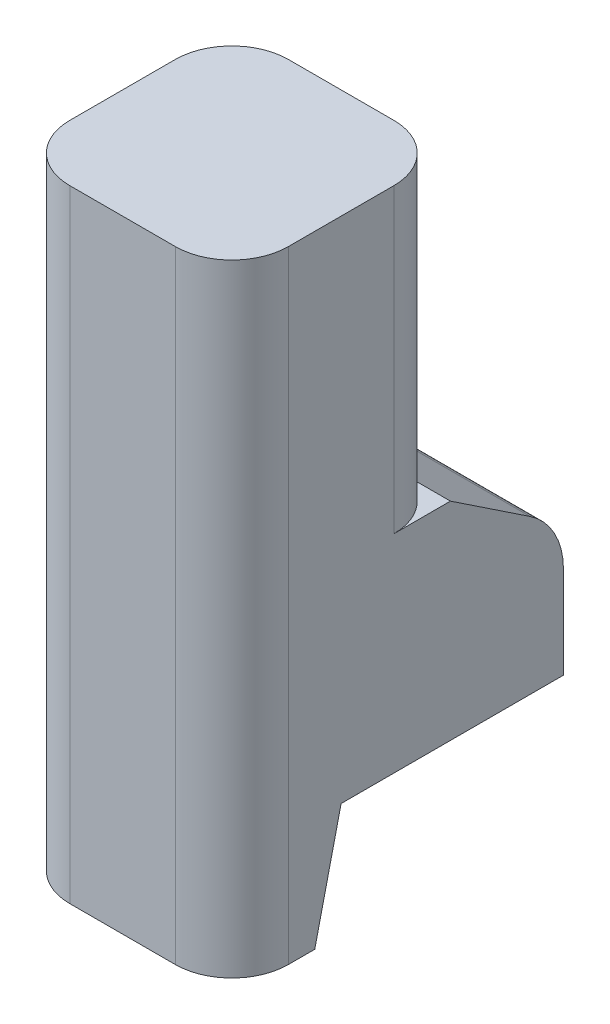
ISO-10303-21;
HEADER;
FILE_DESCRIPTION(('STEP AP214'),'2;1');
FILE_NAME('part.step','',(''),(''),'','','');
FILE_SCHEMA(('AUTOMOTIVE_DESIGN { 1 0 10303 214 1 1 1 1 }'));
ENDSEC;
DATA;
#1=APPLICATION_CONTEXT('core data for automotive mechanical design processes');
#2=APPLICATION_PROTOCOL_DEFINITION('international standard','automotive_design',2000,#1);
#3=PRODUCT_CONTEXT('',#1,'mechanical');
#4=PRODUCT('Part','Part','',(#3));
#5=PRODUCT_RELATED_PRODUCT_CATEGORY('part','',(#4));
#6=PRODUCT_DEFINITION_FORMATION('','',#4);
#7=PRODUCT_DEFINITION_CONTEXT('part definition',#1,'design');
#8=PRODUCT_DEFINITION('design','',#6,#7);
#9=PRODUCT_DEFINITION_SHAPE('','',#8);
#10=(LENGTH_UNIT() NAMED_UNIT(*) SI_UNIT(.MILLI.,.METRE.));
#11=(NAMED_UNIT(*) PLANE_ANGLE_UNIT() SI_UNIT($,.RADIAN.));
#12=(NAMED_UNIT(*) SI_UNIT($,.STERADIAN.) SOLID_ANGLE_UNIT());
#13=UNCERTAINTY_MEASURE_WITH_UNIT(LENGTH_MEASURE(1.E-05),#10,'distance_accuracy_value','');
#14=(GEOMETRIC_REPRESENTATION_CONTEXT(3) GLOBAL_UNCERTAINTY_ASSIGNED_CONTEXT((#13)) GLOBAL_UNIT_ASSIGNED_CONTEXT((#10,
#11,#12)) REPRESENTATION_CONTEXT('',''));
#15=CARTESIAN_POINT('',(0.,0.,0.));
#16=DIRECTION('',(0.,0.,1.));
#17=DIRECTION('',(1.,0.,0.));
#18=AXIS2_PLACEMENT_3D('',#15,#16,#17);
#19=CARTESIAN_POINT('',(5.8,16.5,-5.8));
#20=DIRECTION('',(-1.,0.,0.));
#21=DIRECTION('',(0.,0.,1.));
#22=AXIS2_PLACEMENT_3D('',#19,#20,#21);
#23=PLANE('',#22);
#24=DIRECTION('',(0.,-0.973841209741793,0.227229615606418));
#25=VECTOR('',#24,1.);
#26=CARTESIAN_POINT('',(5.8,17.1085353003161,-3.19199157007376));
#27=LINE('',#26,#25);
#28=CARTESIAN_POINT('',(5.8,3.,0.0999999999999998));
#29=VERTEX_POINT('',#28);
#30=CARTESIAN_POINT('',(5.8,0.,0.8));
#31=VERTEX_POINT('',#30);
#32=EDGE_CURVE('E134',#29,#31,#27,.T.);
#33=ORIENTED_EDGE('',*,*,#32,.F.);
#34=DIRECTION('',(0.,0.,1.));
#35=VECTOR('',#34,1.);
#36=CARTESIAN_POINT('',(5.8,3.,-5.8));
#37=LINE('',#36,#35);
#38=CARTESIAN_POINT('',(5.8,3.,-5.8));
#39=VERTEX_POINT('',#38);
#40=EDGE_CURVE('E143',#39,#29,#37,.T.);
#41=ORIENTED_EDGE('',*,*,#40,.F.);
#42=DIRECTION('',(0.,-1.,0.));
#43=VECTOR('',#42,1.);
#44=CARTESIAN_POINT('',(5.8,16.5,-5.8));
#45=LINE('',#44,#43);
#46=CARTESIAN_POINT('',(5.8,5.42963248302401,-5.8));
#47=VERTEX_POINT('',#46);
#48=EDGE_CURVE('E178',#47,#39,#45,.T.);
#49=ORIENTED_EDGE('',*,*,#48,.F.);
#50=CARTESIAN_POINT('',(5.8,5.42963248302401,-3.8));
#51=DIRECTION('',(-1.,0.,0.));
#52=DIRECTION('',(0.,0.,1.));
#53=AXIS2_PLACEMENT_3D('',#50,#51,#52);
#54=CIRCLE('',#53,2.);
#55=CARTESIAN_POINT('',(5.8,7.09373307169969,-4.90940039245046));
#56=VERTEX_POINT('',#55);
#57=EDGE_CURVE('E11',#47,#56,#54,.F.);
#58=ORIENTED_EDGE('',*,*,#57,.T.);
#59=DIRECTION('',(0.,-0.554700196225229,-0.832050294337844));
#60=VECTOR('',#59,1.);
#61=CARTESIAN_POINT('',(5.8,9.57692307692308,-1.18461538461538));
#62=LINE('',#61,#60);
#63=CARTESIAN_POINT('',(5.8,8.5,-2.8));
#64=VERTEX_POINT('',#63);
#65=EDGE_CURVE('E230',#64,#56,#62,.T.);
#66=ORIENTED_EDGE('',*,*,#65,.F.);
#67=DIRECTION('',(0.,0.,-1.));
#68=VECTOR('',#67,1.);
#69=CARTESIAN_POINT('',(5.8,8.5,-5.8));
#70=LINE('',#69,#68);
#71=CARTESIAN_POINT('',(5.8,8.5,-1.3));
#72=VERTEX_POINT('',#71);
#73=EDGE_CURVE('E246',#72,#64,#70,.T.);
#74=ORIENTED_EDGE('',*,*,#73,.F.);
#75=DIRECTION('',(0.,1.,0.));
#76=VECTOR('',#75,1.);
#77=CARTESIAN_POINT('',(5.8,16.5,-1.3));
#78=LINE('',#77,#76);
#79=CARTESIAN_POINT('',(5.8,16.5,-1.3));
#80=VERTEX_POINT('',#79);
#81=EDGE_CURVE('E203',#72,#80,#78,.T.);
#82=ORIENTED_EDGE('',*,*,#81,.T.);
#83=DIRECTION('',(0.,0.,-1.));
#84=VECTOR('',#83,1.);
#85=CARTESIAN_POINT('',(5.8,16.5,-5.8));
#86=LINE('',#85,#84);
#87=CARTESIAN_POINT('',(5.8,16.5,1.5));
#88=VERTEX_POINT('',#87);
#89=EDGE_CURVE('E161',#88,#80,#86,.T.);
#90=ORIENTED_EDGE('',*,*,#89,.F.);
#91=DIRECTION('',(0.,-1.,0.));
#92=VECTOR('',#91,1.);
#93=CARTESIAN_POINT('',(5.8,16.5,1.5));
#94=LINE('',#93,#92);
#95=CARTESIAN_POINT('',(5.8,0.,1.5));
#96=VERTEX_POINT('',#95);
#97=EDGE_CURVE('E206',#88,#96,#94,.T.);
#98=ORIENTED_EDGE('',*,*,#97,.T.);
#99=DIRECTION('',(0.,0.,-1.));
#100=VECTOR('',#99,1.);
#101=CARTESIAN_POINT('',(5.8,0.,-5.8));
#102=LINE('',#101,#100);
#103=EDGE_CURVE('E142',#96,#31,#102,.T.);
#104=ORIENTED_EDGE('',*,*,#103,.T.);
#105=EDGE_LOOP('',(#33,#41,#49,#58,#66,#74,#82,#90,#98,#104));
#106=FACE_BOUND('',#105,.T.);
#107=ADVANCED_FACE('F33',(#106),#23,.F.);
#108=CARTESIAN_POINT('',(0.,16.5,-5.8));
#109=DIRECTION('',(1.,0.,0.));
#110=DIRECTION('',(0.,0.,-1.));
#111=AXIS2_PLACEMENT_3D('',#108,#109,#110);
#112=PLANE('',#111);
#113=DIRECTION('',(0.,0.973841209741793,-0.227229615606418));
#114=VECTOR('',#113,1.);
#115=CARTESIAN_POINT('',(0.,17.1085353003161,-3.19199157007376));
#116=LINE('',#115,#114);
#117=CARTESIAN_POINT('',(0.,0.,0.8));
#118=VERTEX_POINT('',#117);
#119=CARTESIAN_POINT('',(0.,3.,0.1));
#120=VERTEX_POINT('',#119);
#121=EDGE_CURVE('E137',#118,#120,#116,.T.);
#122=ORIENTED_EDGE('',*,*,#121,.F.);
#123=DIRECTION('',(0.,0.,1.));
#124=VECTOR('',#123,1.);
#125=CARTESIAN_POINT('',(0.,0.,-5.8));
#126=LINE('',#125,#124);
#127=CARTESIAN_POINT('',(0.,0.,1.5));
#128=VERTEX_POINT('',#127);
#129=EDGE_CURVE('E173',#118,#128,#126,.T.);
#130=ORIENTED_EDGE('',*,*,#129,.T.);
#131=DIRECTION('',(0.,-1.,0.));
#132=VECTOR('',#131,1.);
#133=CARTESIAN_POINT('',(0.,16.5,1.5));
#134=LINE('',#133,#132);
#135=CARTESIAN_POINT('',(0.,16.5,1.5));
#136=VERTEX_POINT('',#135);
#137=EDGE_CURVE('E193',#128,#136,#134,.F.);
#138=ORIENTED_EDGE('',*,*,#137,.T.);
#139=DIRECTION('',(0.,0.,1.));
#140=VECTOR('',#139,1.);
#141=CARTESIAN_POINT('',(0.,16.5,-5.8));
#142=LINE('',#141,#140);
#143=CARTESIAN_POINT('',(0.,16.5,-1.3));
#144=VERTEX_POINT('',#143);
#145=EDGE_CURVE('E164',#144,#136,#142,.T.);
#146=ORIENTED_EDGE('',*,*,#145,.F.);
#147=DIRECTION('',(0.,1.,0.));
#148=VECTOR('',#147,1.);
#149=CARTESIAN_POINT('',(0.,16.5,-1.3));
#150=LINE('',#149,#148);
#151=CARTESIAN_POINT('',(0.,8.5,-1.3));
#152=VERTEX_POINT('',#151);
#153=EDGE_CURVE('E190',#144,#152,#150,.F.);
#154=ORIENTED_EDGE('',*,*,#153,.T.);
#155=DIRECTION('',(0.,0.,1.));
#156=VECTOR('',#155,1.);
#157=CARTESIAN_POINT('',(0.,8.5,-5.8));
#158=LINE('',#157,#156);
#159=CARTESIAN_POINT('',(0.,8.5,-2.8));
#160=VERTEX_POINT('',#159);
#161=EDGE_CURVE('E235',#160,#152,#158,.T.);
#162=ORIENTED_EDGE('',*,*,#161,.F.);
#163=DIRECTION('',(0.,0.554700196225229,0.832050294337844));
#164=VECTOR('',#163,1.);
#165=CARTESIAN_POINT('',(0.,9.57692307692308,-1.18461538461538));
#166=LINE('',#165,#164);
#167=CARTESIAN_POINT('',(0.,7.09373307169969,-4.90940039245046));
#168=VERTEX_POINT('',#167);
#169=EDGE_CURVE('E227',#168,#160,#166,.T.);
#170=ORIENTED_EDGE('',*,*,#169,.F.);
#171=CARTESIAN_POINT('',(0.,5.42963248302401,-3.8));
#172=DIRECTION('',(1.,0.,0.));
#173=DIRECTION('',(0.,0.,-1.));
#174=AXIS2_PLACEMENT_3D('',#171,#172,#173);
#175=CIRCLE('',#174,2.);
#176=CARTESIAN_POINT('',(0.,5.42963248302401,-5.8));
#177=VERTEX_POINT('',#176);
#178=EDGE_CURVE('E55',#168,#177,#175,.F.);
#179=ORIENTED_EDGE('',*,*,#178,.T.);
#180=DIRECTION('',(0.,-1.,0.));
#181=VECTOR('',#180,1.);
#182=CARTESIAN_POINT('',(0.,16.5,-5.8));
#183=LINE('',#182,#181);
#184=CARTESIAN_POINT('',(0.,3.,-5.8));
#185=VERTEX_POINT('',#184);
#186=EDGE_CURVE('E171',#177,#185,#183,.T.);
#187=ORIENTED_EDGE('',*,*,#186,.T.);
#188=DIRECTION('',(0.,0.,-1.));
#189=VECTOR('',#188,1.);
#190=CARTESIAN_POINT('',(0.,3.,-5.8));
#191=LINE('',#190,#189);
#192=EDGE_CURVE('E157',#120,#185,#191,.T.);
#193=ORIENTED_EDGE('',*,*,#192,.F.);
#194=EDGE_LOOP('',(#122,#130,#138,#146,#154,#162,#170,#179,#187,#193));
#195=FACE_BOUND('',#194,.T.);
#196=ADVANCED_FACE('F234',(#195),#112,.F.);
#197=CARTESIAN_POINT('',(0.,0.,0.));
#198=DIRECTION('',(0.,-1.,0.));
#199=DIRECTION('',(0.,0.,-1.));
#200=AXIS2_PLACEMENT_3D('',#197,#198,#199);
#201=PLANE('',#200);
#202=ORIENTED_EDGE('',*,*,#129,.F.);
#203=DIRECTION('',(-1.,0.,0.));
#204=VECTOR('',#203,1.);
#205=CARTESIAN_POINT('',(37.5235188520164,0.,0.799999999999996));
#206=LINE('',#205,#204);
#207=EDGE_CURVE('E314',#31,#118,#206,.T.);
#208=ORIENTED_EDGE('',*,*,#207,.F.);
#209=ORIENTED_EDGE('',*,*,#103,.F.);
#210=CARTESIAN_POINT('',(4.3,0.,1.5));
#211=DIRECTION('',(0.,-1.,0.));
#212=DIRECTION('',(0.,0.,-1.));
#213=AXIS2_PLACEMENT_3D('',#210,#211,#212);
#214=CIRCLE('',#213,1.5);
#215=CARTESIAN_POINT('',(4.3,0.,3.));
#216=VERTEX_POINT('',#215);
#217=EDGE_CURVE('E185',#96,#216,#214,.T.);
#218=ORIENTED_EDGE('',*,*,#217,.T.);
#219=DIRECTION('',(1.,0.,0.));
#220=VECTOR('',#219,1.);
#221=CARTESIAN_POINT('',(5.8,0.,3.));
#222=LINE('',#221,#220);
#223=CARTESIAN_POINT('',(1.5,0.,3.));
#224=VERTEX_POINT('',#223);
#225=EDGE_CURVE('E165',#224,#216,#222,.T.);
#226=ORIENTED_EDGE('',*,*,#225,.F.);
#227=CARTESIAN_POINT('',(1.5,0.,1.5));
#228=DIRECTION('',(0.,-1.,0.));
#229=DIRECTION('',(0.,0.,-1.));
#230=AXIS2_PLACEMENT_3D('',#227,#228,#229);
#231=CIRCLE('',#230,1.5);
#232=EDGE_CURVE('E187',#224,#128,#231,.T.);
#233=ORIENTED_EDGE('',*,*,#232,.T.);
#234=EDGE_LOOP('',(#202,#208,#209,#218,#226,#233));
#235=FACE_BOUND('',#234,.T.);
#236=ADVANCED_FACE('F270',(#235),#201,.T.);
#237=CARTESIAN_POINT('',(5.8,16.5,-5.8));
#238=DIRECTION('',(0.,0.,1.));
#239=DIRECTION('',(1.,0.,0.));
#240=AXIS2_PLACEMENT_3D('',#237,#238,#239);
#241=PLANE('',#240);
#242=ORIENTED_EDGE('',*,*,#186,.F.);
#243=DIRECTION('',(-1.,0.,0.));
#244=VECTOR('',#243,1.);
#245=CARTESIAN_POINT('',(5.8,5.42963248302401,-5.8));
#246=LINE('',#245,#244);
#247=EDGE_CURVE('E41',#177,#47,#246,.F.);
#248=ORIENTED_EDGE('',*,*,#247,.T.);
#249=ORIENTED_EDGE('',*,*,#48,.T.);
#250=DIRECTION('',(1.,0.,0.));
#251=VECTOR('',#250,1.);
#252=CARTESIAN_POINT('',(0.,3.,-5.8));
#253=LINE('',#252,#251);
#254=EDGE_CURVE('E155',#185,#39,#253,.T.);
#255=ORIENTED_EDGE('',*,*,#254,.F.);
#256=EDGE_LOOP('',(#242,#248,#249,#255));
#257=FACE_BOUND('',#256,.T.);
#258=ADVANCED_FACE('F256',(#257),#241,.F.);
#259=CARTESIAN_POINT('',(0.,8.5,0.));
#260=DIRECTION('',(0.,1.,0.));
#261=DIRECTION('',(0.,0.,1.));
#262=AXIS2_PLACEMENT_3D('',#259,#260,#261);
#263=PLANE('',#262);
#264=ORIENTED_EDGE('',*,*,#73,.T.);
#265=DIRECTION('',(-1.,0.,0.));
#266=VECTOR('',#265,1.);
#267=CARTESIAN_POINT('',(30.2735188520164,8.5,-2.8));
#268=LINE('',#267,#266);
#269=CARTESIAN_POINT('',(4.3,8.5,-2.8));
#270=VERTEX_POINT('',#269);
#271=EDGE_CURVE('E236',#64,#270,#268,.T.);
#272=ORIENTED_EDGE('',*,*,#271,.T.);
#273=CARTESIAN_POINT('',(4.3,8.5,-1.3));
#274=DIRECTION('',(0.,1.,0.));
#275=DIRECTION('',(0.,0.,1.));
#276=AXIS2_PLACEMENT_3D('',#273,#274,#275);
#277=CIRCLE('',#276,1.5);
#278=EDGE_CURVE('E214',#270,#72,#277,.F.);
#279=ORIENTED_EDGE('',*,*,#278,.T.);
#280=EDGE_LOOP('',(#264,#272,#279));
#281=FACE_BOUND('',#280,.T.);
#282=ADVANCED_FACE('F302',(#281),#263,.T.);
#283=CARTESIAN_POINT('',(1.5,8.5,-1.3));
#284=DIRECTION('',(0.,1.,0.));
#285=DIRECTION('',(0.,0.,1.));
#286=AXIS2_PLACEMENT_3D('',#283,#284,#285);
#287=CIRCLE('',#286,1.5);
#288=CARTESIAN_POINT('',(1.5,8.5,-2.8));
#289=VERTEX_POINT('',#288);
#290=EDGE_CURVE('E217',#152,#289,#287,.F.);
#291=ORIENTED_EDGE('',*,*,#290,.T.);
#292=EDGE_CURVE('E150',#289,#160,#268,.T.);
#293=ORIENTED_EDGE('',*,*,#292,.T.);
#294=ORIENTED_EDGE('',*,*,#161,.T.);
#295=EDGE_LOOP('',(#291,#293,#294));
#296=FACE_BOUND('',#295,.T.);
#297=ADVANCED_FACE('F296',(#296),#263,.T.);
#298=CARTESIAN_POINT('',(5.8,16.5,3.));
#299=DIRECTION('',(0.,0.,-1.));
#300=DIRECTION('',(-1.,0.,0.));
#301=AXIS2_PLACEMENT_3D('',#298,#299,#300);
#302=PLANE('',#301);
#303=DIRECTION('',(1.,0.,0.));
#304=VECTOR('',#303,1.);
#305=CARTESIAN_POINT('',(5.8,16.5,3.));
#306=LINE('',#305,#304);
#307=CARTESIAN_POINT('',(1.5,16.5,3.));
#308=VERTEX_POINT('',#307);
#309=CARTESIAN_POINT('',(4.3,16.5,3.));
#310=VERTEX_POINT('',#309);
#311=EDGE_CURVE('E168',#308,#310,#306,.T.);
#312=ORIENTED_EDGE('',*,*,#311,.F.);
#313=DIRECTION('',(0.,-1.,0.));
#314=VECTOR('',#313,1.);
#315=CARTESIAN_POINT('',(1.5,16.5,3.));
#316=LINE('',#315,#314);
#317=EDGE_CURVE('E182',#308,#224,#316,.T.);
#318=ORIENTED_EDGE('',*,*,#317,.T.);
#319=ORIENTED_EDGE('',*,*,#225,.T.);
#320=DIRECTION('',(0.,-1.,0.));
#321=VECTOR('',#320,1.);
#322=CARTESIAN_POINT('',(4.3,16.5,3.));
#323=LINE('',#322,#321);
#324=EDGE_CURVE('E180',#216,#310,#323,.F.);
#325=ORIENTED_EDGE('',*,*,#324,.T.);
#326=EDGE_LOOP('',(#312,#318,#319,#325));
#327=FACE_BOUND('',#326,.T.);
#328=ADVANCED_FACE('F322',(#327),#302,.F.);
#329=CARTESIAN_POINT('',(0.,16.5,0.));
#330=DIRECTION('',(0.,-1.,0.));
#331=DIRECTION('',(0.,0.,-1.));
#332=AXIS2_PLACEMENT_3D('',#329,#330,#331);
#333=PLANE('',#332);
#334=ORIENTED_EDGE('',*,*,#145,.T.);
#335=CARTESIAN_POINT('',(1.5,16.5,1.5));
#336=DIRECTION('',(0.,-1.,0.));
#337=DIRECTION('',(0.,0.,-1.));
#338=AXIS2_PLACEMENT_3D('',#335,#336,#337);
#339=CIRCLE('',#338,1.5);
#340=EDGE_CURVE('E201',#136,#308,#339,.F.);
#341=ORIENTED_EDGE('',*,*,#340,.T.);
#342=ORIENTED_EDGE('',*,*,#311,.T.);
#343=CARTESIAN_POINT('',(4.3,16.5,1.5));
#344=DIRECTION('',(0.,-1.,0.));
#345=DIRECTION('',(0.,0.,-1.));
#346=AXIS2_PLACEMENT_3D('',#343,#344,#345);
#347=CIRCLE('',#346,1.5);
#348=EDGE_CURVE('E199',#310,#88,#347,.F.);
#349=ORIENTED_EDGE('',*,*,#348,.T.);
#350=ORIENTED_EDGE('',*,*,#89,.T.);
#351=CARTESIAN_POINT('',(4.3,16.5,-1.3));
#352=DIRECTION('',(0.,-1.,0.));
#353=DIRECTION('',(0.,0.,-1.));
#354=AXIS2_PLACEMENT_3D('',#351,#352,#353);
#355=CIRCLE('',#354,1.5);
#356=CARTESIAN_POINT('',(4.3,16.5,-2.8));
#357=VERTEX_POINT('',#356);
#358=EDGE_CURVE('E197',#80,#357,#355,.F.);
#359=ORIENTED_EDGE('',*,*,#358,.T.);
#360=DIRECTION('',(1.,0.,0.));
#361=VECTOR('',#360,1.);
#362=CARTESIAN_POINT('',(0.,16.5,-2.8));
#363=LINE('',#362,#361);
#364=CARTESIAN_POINT('',(1.5,16.5,-2.8));
#365=VERTEX_POINT('',#364);
#366=EDGE_CURVE('E238',#365,#357,#363,.T.);
#367=ORIENTED_EDGE('',*,*,#366,.F.);
#368=CARTESIAN_POINT('',(1.5,16.5,-1.3));
#369=DIRECTION('',(0.,-1.,0.));
#370=DIRECTION('',(0.,0.,-1.));
#371=AXIS2_PLACEMENT_3D('',#368,#369,#370);
#372=CIRCLE('',#371,1.5);
#373=EDGE_CURVE('E195',#365,#144,#372,.F.);
#374=ORIENTED_EDGE('',*,*,#373,.T.);
#375=EDGE_LOOP('',(#334,#341,#342,#349,#350,#359,#367,#374));
#376=FACE_BOUND('',#375,.T.);
#377=ADVANCED_FACE('F307',(#376),#333,.F.);
#378=CARTESIAN_POINT('',(0.,3.,0.));
#379=DIRECTION('',(0.,1.,0.));
#380=DIRECTION('',(0.,0.,1.));
#381=AXIS2_PLACEMENT_3D('',#378,#379,#380);
#382=PLANE('',#381);
#383=CARTESIAN_POINT('',(2.9,3.,-2.9));
#384=DIRECTION('',(0.,-1.,0.));
#385=DIRECTION('',(0.,0.,-1.));
#386=AXIS2_PLACEMENT_3D('',#383,#384,#385);
#387=CIRCLE('',#386,1.75);
#388=CARTESIAN_POINT('',(2.9,3.,-4.65));
#389=VERTEX_POINT('',#388);
#390=EDGE_CURVE('E249',#389,#389,#387,.T.);
#391=ORIENTED_EDGE('',*,*,#390,.F.);
#392=EDGE_LOOP('',(#391));
#393=FACE_BOUND('',#392,.T.);
#394=ORIENTED_EDGE('',*,*,#192,.T.);
#395=ORIENTED_EDGE('',*,*,#254,.T.);
#396=ORIENTED_EDGE('',*,*,#40,.T.);
#397=DIRECTION('',(-1.,0.,0.));
#398=VECTOR('',#397,1.);
#399=CARTESIAN_POINT('',(0.,3.,0.1));
#400=LINE('',#399,#398);
#401=EDGE_CURVE('E131',#29,#120,#400,.T.);
#402=ORIENTED_EDGE('',*,*,#401,.T.);
#403=EDGE_LOOP('',(#394,#395,#396,#402));
#404=FACE_BOUND('',#403,.T.);
#405=ADVANCED_FACE('F153',(#393,#404),#382,.F.);
#406=CARTESIAN_POINT('',(2.9,5.5,-2.9));
#407=DIRECTION('',(0.,-1.,0.));
#408=DIRECTION('',(0.,0.,-1.));
#409=AXIS2_PLACEMENT_3D('',#406,#407,#408);
#410=CYLINDRICAL_SURFACE('',#409,1.75);
#411=CARTESIAN_POINT('',(2.9,5.5,-2.9));
#412=DIRECTION('',(0.,-1.,0.));
#413=DIRECTION('',(0.,0.,-1.));
#414=AXIS2_PLACEMENT_3D('',#411,#412,#413);
#415=CIRCLE('',#414,1.75);
#416=CARTESIAN_POINT('',(2.9,5.5,-4.65));
#417=VERTEX_POINT('',#416);
#418=EDGE_CURVE('E252',#417,#417,#415,.T.);
#419=ORIENTED_EDGE('',*,*,#418,.F.);
#420=EDGE_LOOP('',(#419));
#421=FACE_BOUND('',#420,.T.);
#422=ORIENTED_EDGE('',*,*,#390,.T.);
#423=EDGE_LOOP('',(#422));
#424=FACE_BOUND('',#423,.T.);
#425=ADVANCED_FACE('F336',(#421,#424),#410,.F.);
#426=CARTESIAN_POINT('',(2.9,5.5,-2.9));
#427=DIRECTION('',(0.,-1.,0.));
#428=DIRECTION('',(0.,0.,-1.));
#429=AXIS2_PLACEMENT_3D('',#426,#427,#428);
#430=PLANE('',#429);
#431=ORIENTED_EDGE('',*,*,#418,.T.);
#432=EDGE_LOOP('',(#431));
#433=FACE_BOUND('',#432,.T.);
#434=ADVANCED_FACE('F340',(#433),#430,.T.);
#435=CARTESIAN_POINT('',(0.,8.5,-2.8));
#436=DIRECTION('',(0.,0.,1.));
#437=DIRECTION('',(1.,0.,0.));
#438=AXIS2_PLACEMENT_3D('',#435,#436,#437);
#439=PLANE('',#438);
#440=ORIENTED_EDGE('',*,*,#366,.T.);
#441=DIRECTION('',(0.,1.,0.));
#442=VECTOR('',#441,1.);
#443=CARTESIAN_POINT('',(4.3,8.5,-2.8));
#444=LINE('',#443,#442);
#445=EDGE_CURVE('E211',#357,#270,#444,.F.);
#446=ORIENTED_EDGE('',*,*,#445,.T.);
#447=DIRECTION('',(1.,0.,0.));
#448=VECTOR('',#447,1.);
#449=CARTESIAN_POINT('',(0.,8.5,-2.8));
#450=LINE('',#449,#448);
#451=EDGE_CURVE('E244',#289,#270,#450,.T.);
#452=ORIENTED_EDGE('',*,*,#451,.F.);
#453=DIRECTION('',(0.,1.,0.));
#454=VECTOR('',#453,1.);
#455=CARTESIAN_POINT('',(1.5,8.5,-2.8));
#456=LINE('',#455,#454);
#457=EDGE_CURVE('E208',#289,#365,#456,.T.);
#458=ORIENTED_EDGE('',*,*,#457,.T.);
#459=EDGE_LOOP('',(#440,#446,#452,#458));
#460=FACE_BOUND('',#459,.T.);
#461=ADVANCED_FACE('F278',(#460),#439,.F.);
#462=CARTESIAN_POINT('',(1.5,16.5,1.5));
#463=DIRECTION('',(0.,-1.,0.));
#464=DIRECTION('',(0.,0.,-1.));
#465=AXIS2_PLACEMENT_3D('',#462,#463,#464);
#466=CYLINDRICAL_SURFACE('',#465,1.5);
#467=ORIENTED_EDGE('',*,*,#340,.F.);
#468=ORIENTED_EDGE('',*,*,#137,.F.);
#469=ORIENTED_EDGE('',*,*,#232,.F.);
#470=ORIENTED_EDGE('',*,*,#317,.F.);
#471=EDGE_LOOP('',(#467,#468,#469,#470));
#472=FACE_BOUND('',#471,.T.);
#473=ADVANCED_FACE('F274',(#472),#466,.T.);
#474=CARTESIAN_POINT('',(4.3,16.5,1.5));
#475=DIRECTION('',(0.,-1.,0.));
#476=DIRECTION('',(0.,0.,-1.));
#477=AXIS2_PLACEMENT_3D('',#474,#475,#476);
#478=CYLINDRICAL_SURFACE('',#477,1.5);
#479=ORIENTED_EDGE('',*,*,#348,.F.);
#480=ORIENTED_EDGE('',*,*,#324,.F.);
#481=ORIENTED_EDGE('',*,*,#217,.F.);
#482=ORIENTED_EDGE('',*,*,#97,.F.);
#483=EDGE_LOOP('',(#479,#480,#481,#482));
#484=FACE_BOUND('',#483,.T.);
#485=ADVANCED_FACE('F277',(#484),#478,.T.);
#486=CARTESIAN_POINT('',(4.3,16.5,-1.3));
#487=DIRECTION('',(0.,1.,0.));
#488=DIRECTION('',(0.,0.,1.));
#489=AXIS2_PLACEMENT_3D('',#486,#487,#488);
#490=CYLINDRICAL_SURFACE('',#489,1.5);
#491=ORIENTED_EDGE('',*,*,#278,.F.);
#492=ORIENTED_EDGE('',*,*,#445,.F.);
#493=ORIENTED_EDGE('',*,*,#358,.F.);
#494=ORIENTED_EDGE('',*,*,#81,.F.);
#495=EDGE_LOOP('',(#491,#492,#493,#494));
#496=FACE_BOUND('',#495,.T.);
#497=ADVANCED_FACE('F282',(#496),#490,.T.);
#498=CARTESIAN_POINT('',(1.5,8.5,-1.3));
#499=DIRECTION('',(0.,1.,0.));
#500=DIRECTION('',(0.,0.,1.));
#501=AXIS2_PLACEMENT_3D('',#498,#499,#500);
#502=CYLINDRICAL_SURFACE('',#501,1.5);
#503=ORIENTED_EDGE('',*,*,#290,.F.);
#504=ORIENTED_EDGE('',*,*,#153,.F.);
#505=ORIENTED_EDGE('',*,*,#373,.F.);
#506=ORIENTED_EDGE('',*,*,#457,.F.);
#507=EDGE_LOOP('',(#503,#504,#505,#506));
#508=FACE_BOUND('',#507,.T.);
#509=ADVANCED_FACE('F263',(#508),#502,.T.);
#510=CARTESIAN_POINT('',(30.2735188520164,8.5,-2.8));
#511=DIRECTION('',(0.,0.832050294337844,-0.554700196225229));
#512=DIRECTION('',(0.,0.554700196225229,0.832050294337844));
#513=AXIS2_PLACEMENT_3D('',#510,#511,#512);
#514=PLANE('',#513);
#515=ORIENTED_EDGE('',*,*,#65,.T.);
#516=DIRECTION('',(-1.,0.,0.));
#517=VECTOR('',#516,1.);
#518=CARTESIAN_POINT('',(0.,7.09373307169969,-4.90940039245046));
#519=LINE('',#518,#517);
#520=EDGE_CURVE('E220',#56,#168,#519,.T.);
#521=ORIENTED_EDGE('',*,*,#520,.T.);
#522=ORIENTED_EDGE('',*,*,#169,.T.);
#523=ORIENTED_EDGE('',*,*,#292,.F.);
#524=ORIENTED_EDGE('',*,*,#451,.T.);
#525=ORIENTED_EDGE('',*,*,#271,.F.);
#526=EDGE_LOOP('',(#515,#521,#522,#523,#524,#525));
#527=FACE_BOUND('',#526,.T.);
#528=ADVANCED_FACE('F226',(#527),#514,.T.);
#529=CARTESIAN_POINT('',(30.2735188520164,5.42963248302401,-3.8));
#530=DIRECTION('',(1.,0.,0.));
#531=DIRECTION('',(0.,0.,-1.));
#532=AXIS2_PLACEMENT_3D('',#529,#530,#531);
#533=CYLINDRICAL_SURFACE('',#532,2.);
#534=ORIENTED_EDGE('',*,*,#57,.F.);
#535=ORIENTED_EDGE('',*,*,#247,.F.);
#536=ORIENTED_EDGE('',*,*,#178,.F.);
#537=ORIENTED_EDGE('',*,*,#520,.F.);
#538=EDGE_LOOP('',(#534,#535,#536,#537));
#539=FACE_BOUND('',#538,.T.);
#540=ADVANCED_FACE('F35',(#539),#533,.T.);
#541=CARTESIAN_POINT('',(37.5235188520164,3.,0.0999999999999967));
#542=DIRECTION('',(0.,-0.227229615606418,-0.973841209741793));
#543=DIRECTION('',(0.,0.973841209741793,-0.227229615606418));
#544=AXIS2_PLACEMENT_3D('',#541,#542,#543);
#545=PLANE('',#544);
#546=ORIENTED_EDGE('',*,*,#401,.F.);
#547=ORIENTED_EDGE('',*,*,#32,.T.);
#548=ORIENTED_EDGE('',*,*,#207,.T.);
#549=ORIENTED_EDGE('',*,*,#121,.T.);
#550=EDGE_LOOP('',(#546,#547,#548,#549));
#551=FACE_BOUND('',#550,.T.);
#552=ADVANCED_FACE('F133',(#551),#545,.T.);
#553=CLOSED_SHELL('',(#107,#196,#236,#258,#282,#297,#328,#377,#405,#425,#434,#461,#473,#485,
#497,#509,#528,#540,#552));
#554=MANIFOLD_SOLID_BREP('B2',#553);
#555=ADVANCED_BREP_SHAPE_REPRESENTATION('',(#18,#554),#14);
#556=SHAPE_DEFINITION_REPRESENTATION(#9,#555);
ENDSEC;
END-ISO-10303-21;
